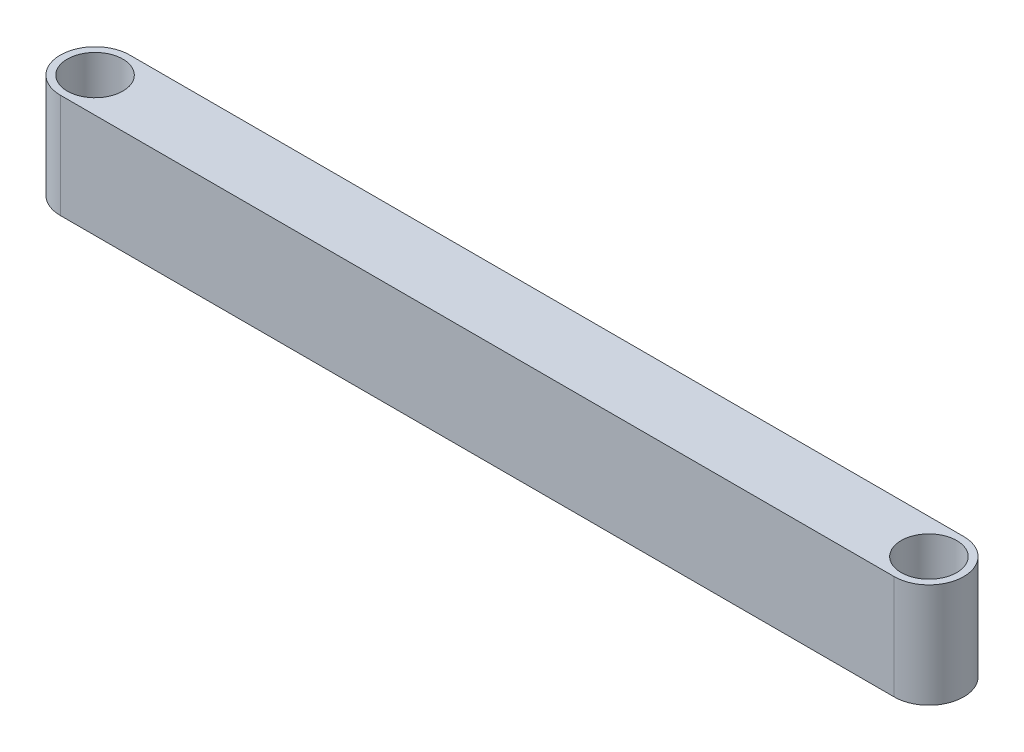
ISO-10303-21;
HEADER;
FILE_DESCRIPTION(('STEP AP214'),'2;1');
FILE_NAME('part.step','',(''),(''),'','','');
FILE_SCHEMA(('AUTOMOTIVE_DESIGN { 1 0 10303 214 1 1 1 1 }'));
ENDSEC;
DATA;
#1=APPLICATION_CONTEXT('core data for automotive mechanical design processes');
#2=APPLICATION_PROTOCOL_DEFINITION('international standard','automotive_design',2000,#1);
#3=PRODUCT_CONTEXT('',#1,'mechanical');
#4=PRODUCT('Part','Part','',(#3));
#5=PRODUCT_RELATED_PRODUCT_CATEGORY('part','',(#4));
#6=PRODUCT_DEFINITION_FORMATION('','',#4);
#7=PRODUCT_DEFINITION_CONTEXT('part definition',#1,'design');
#8=PRODUCT_DEFINITION('design','',#6,#7);
#9=PRODUCT_DEFINITION_SHAPE('','',#8);
#10=(LENGTH_UNIT() NAMED_UNIT(*) SI_UNIT(.MILLI.,.METRE.));
#11=(NAMED_UNIT(*) PLANE_ANGLE_UNIT() SI_UNIT($,.RADIAN.));
#12=(NAMED_UNIT(*) SI_UNIT($,.STERADIAN.) SOLID_ANGLE_UNIT());
#13=UNCERTAINTY_MEASURE_WITH_UNIT(LENGTH_MEASURE(1.E-05),#10,'distance_accuracy_value','');
#14=(GEOMETRIC_REPRESENTATION_CONTEXT(3) GLOBAL_UNCERTAINTY_ASSIGNED_CONTEXT((#13)) GLOBAL_UNIT_ASSIGNED_CONTEXT((#10,
#11,#12)) REPRESENTATION_CONTEXT('',''));
#15=CARTESIAN_POINT('',(0.,0.,0.));
#16=DIRECTION('',(0.,0.,1.));
#17=DIRECTION('',(1.,0.,0.));
#18=AXIS2_PLACEMENT_3D('',#15,#16,#17);
#19=CARTESIAN_POINT('',(-56.2743725544239,1.5,-11.7174624624736));
#20=DIRECTION('',(0.,1.,0.));
#21=DIRECTION('',(0.,0.,1.));
#22=AXIS2_PLACEMENT_3D('',#19,#20,#21);
#23=PLANE('',#22);
#24=CARTESIAN_POINT('',(-56.2743725544239,1.5,-11.7174624624736));
#25=DIRECTION('',(0.,1.,0.));
#26=DIRECTION('',(0.,0.,1.));
#27=AXIS2_PLACEMENT_3D('',#24,#25,#26);
#28=CIRCLE('',#27,0.399999999999998);
#29=CARTESIAN_POINT('',(-56.2743725544239,1.5,-11.3174624624736));
#30=VERTEX_POINT('',#29);
#31=EDGE_CURVE('E112',#30,#30,#28,.T.);
#32=ORIENTED_EDGE('',*,*,#31,.F.);
#33=EDGE_LOOP('',(#32));
#34=FACE_BOUND('',#33,.T.);
#35=CARTESIAN_POINT('',(-56.2743725544239,1.5,-11.7174624624736));
#36=DIRECTION('',(0.,1.,0.));
#37=DIRECTION('',(0.,0.,1.));
#38=AXIS2_PLACEMENT_3D('',#35,#36,#37);
#39=CIRCLE('',#38,0.5);
#40=CARTESIAN_POINT('',(-56.2743725544239,1.5,-12.2174624624736));
#41=VERTEX_POINT('',#40);
#42=CARTESIAN_POINT('',(-56.2743725544239,1.5,-11.2174624624736));
#43=VERTEX_POINT('',#42);
#44=EDGE_CURVE('E92',#41,#43,#39,.T.);
#45=ORIENTED_EDGE('',*,*,#44,.T.);
#46=DIRECTION('',(1.,0.,0.));
#47=VECTOR('',#46,1.);
#48=CARTESIAN_POINT('',(-56.2743725544239,1.5,-11.2174624624736));
#49=LINE('',#48,#47);
#50=CARTESIAN_POINT('',(-44.2743725544239,1.5,-11.2174624624736));
#51=VERTEX_POINT('',#50);
#52=EDGE_CURVE('E87',#43,#51,#49,.T.);
#53=ORIENTED_EDGE('',*,*,#52,.T.);
#54=CARTESIAN_POINT('',(-44.2743725544239,1.5,-11.7174624624736));
#55=DIRECTION('',(0.,1.,0.));
#56=DIRECTION('',(0.,0.,1.));
#57=AXIS2_PLACEMENT_3D('',#54,#55,#56);
#58=CIRCLE('',#57,0.5);
#59=CARTESIAN_POINT('',(-44.2743725544239,1.5,-12.2174624624736));
#60=VERTEX_POINT('',#59);
#61=EDGE_CURVE('E90',#51,#60,#58,.T.);
#62=ORIENTED_EDGE('',*,*,#61,.T.);
#63=DIRECTION('',(-1.,0.,0.));
#64=VECTOR('',#63,1.);
#65=CARTESIAN_POINT('',(-56.2743725544239,1.5,-12.2174624624736));
#66=LINE('',#65,#64);
#67=EDGE_CURVE('E57',#60,#41,#66,.T.);
#68=ORIENTED_EDGE('',*,*,#67,.T.);
#69=EDGE_LOOP('',(#45,#53,#62,#68));
#70=FACE_BOUND('',#69,.T.);
#71=CARTESIAN_POINT('',(-44.2743725544239,1.5,-11.7174624624736));
#72=DIRECTION('',(0.,1.,0.));
#73=DIRECTION('',(0.,0.,1.));
#74=AXIS2_PLACEMENT_3D('',#71,#72,#73);
#75=CIRCLE('',#74,0.399999999999998);
#76=CARTESIAN_POINT('',(-44.2743725544239,1.5,-11.3174624624736));
#77=VERTEX_POINT('',#76);
#78=EDGE_CURVE('E134',#77,#77,#75,.T.);
#79=ORIENTED_EDGE('',*,*,#78,.F.);
#80=EDGE_LOOP('',(#79));
#81=FACE_BOUND('',#80,.T.);
#82=ADVANCED_FACE('F39',(#34,#70,#81),#23,.T.);
#83=CARTESIAN_POINT('',(-56.2743725544239,0.,-11.7174624624736));
#84=DIRECTION('',(0.,1.,0.));
#85=DIRECTION('',(0.,0.,1.));
#86=AXIS2_PLACEMENT_3D('',#83,#84,#85);
#87=PLANE('',#86);
#88=CARTESIAN_POINT('',(-56.2743725544239,0.,-11.7174624624736));
#89=DIRECTION('',(0.,1.,0.));
#90=DIRECTION('',(0.,0.,1.));
#91=AXIS2_PLACEMENT_3D('',#88,#89,#90);
#92=CIRCLE('',#91,0.5);
#93=CARTESIAN_POINT('',(-56.2743725544239,0.,-12.2174624624736));
#94=VERTEX_POINT('',#93);
#95=CARTESIAN_POINT('',(-56.2743725544239,0.,-11.2174624624736));
#96=VERTEX_POINT('',#95);
#97=EDGE_CURVE('E108',#94,#96,#92,.T.);
#98=ORIENTED_EDGE('',*,*,#97,.F.);
#99=DIRECTION('',(-1.,0.,0.));
#100=VECTOR('',#99,1.);
#101=CARTESIAN_POINT('',(-56.2743725544239,0.,-12.2174624624736));
#102=LINE('',#101,#100);
#103=CARTESIAN_POINT('',(-44.2743725544239,0.,-12.2174624624736));
#104=VERTEX_POINT('',#103);
#105=EDGE_CURVE('E80',#104,#94,#102,.T.);
#106=ORIENTED_EDGE('',*,*,#105,.F.);
#107=CARTESIAN_POINT('',(-44.2743725544239,0.,-11.7174624624736));
#108=DIRECTION('',(0.,1.,0.));
#109=DIRECTION('',(0.,0.,1.));
#110=AXIS2_PLACEMENT_3D('',#107,#108,#109);
#111=CIRCLE('',#110,0.5);
#112=CARTESIAN_POINT('',(-44.2743725544239,0.,-11.2174624624736));
#113=VERTEX_POINT('',#112);
#114=EDGE_CURVE('E74',#113,#104,#111,.T.);
#115=ORIENTED_EDGE('',*,*,#114,.F.);
#116=DIRECTION('',(1.,0.,0.));
#117=VECTOR('',#116,1.);
#118=CARTESIAN_POINT('',(-56.2743725544239,0.,-11.2174624624736));
#119=LINE('',#118,#117);
#120=EDGE_CURVE('E97',#96,#113,#119,.T.);
#121=ORIENTED_EDGE('',*,*,#120,.F.);
#122=EDGE_LOOP('',(#98,#106,#115,#121));
#123=FACE_BOUND('',#122,.T.);
#124=CARTESIAN_POINT('',(-56.2743725544239,0.,-11.7174624624736));
#125=DIRECTION('',(0.,1.,0.));
#126=DIRECTION('',(0.,0.,1.));
#127=AXIS2_PLACEMENT_3D('',#124,#125,#126);
#128=CIRCLE('',#127,0.399999999999998);
#129=CARTESIAN_POINT('',(-56.2743725544239,0.,-11.3174624624736));
#130=VERTEX_POINT('',#129);
#131=EDGE_CURVE('E130',#130,#130,#128,.T.);
#132=ORIENTED_EDGE('',*,*,#131,.T.);
#133=EDGE_LOOP('',(#132));
#134=FACE_BOUND('',#133,.T.);
#135=CARTESIAN_POINT('',(-44.2743725544239,0.,-11.7174624624736));
#136=DIRECTION('',(0.,1.,0.));
#137=DIRECTION('',(0.,0.,1.));
#138=AXIS2_PLACEMENT_3D('',#135,#136,#137);
#139=CIRCLE('',#138,0.399999999999998);
#140=CARTESIAN_POINT('',(-44.2743725544239,0.,-11.3174624624736));
#141=VERTEX_POINT('',#140);
#142=EDGE_CURVE('E138',#141,#141,#139,.T.);
#143=ORIENTED_EDGE('',*,*,#142,.T.);
#144=EDGE_LOOP('',(#143));
#145=FACE_BOUND('',#144,.T.);
#146=ADVANCED_FACE('F125',(#123,#134,#145),#87,.F.);
#147=CARTESIAN_POINT('',(-56.2743725544239,1.5,-11.7174624624736));
#148=DIRECTION('',(0.,-1.,0.));
#149=DIRECTION('',(0.,0.,-1.));
#150=AXIS2_PLACEMENT_3D('',#147,#148,#149);
#151=CYLINDRICAL_SURFACE('',#150,0.5);
#152=ORIENTED_EDGE('',*,*,#97,.T.);
#153=DIRECTION('',(0.,-1.,0.));
#154=VECTOR('',#153,1.);
#155=CARTESIAN_POINT('',(-56.2743725544239,1.5,-11.2174624624736));
#156=LINE('',#155,#154);
#157=EDGE_CURVE('E11',#43,#96,#156,.T.);
#158=ORIENTED_EDGE('',*,*,#157,.F.);
#159=ORIENTED_EDGE('',*,*,#44,.F.);
#160=DIRECTION('',(0.,-1.,0.));
#161=VECTOR('',#160,1.);
#162=CARTESIAN_POINT('',(-56.2743725544239,1.5,-12.2174624624736));
#163=LINE('',#162,#161);
#164=EDGE_CURVE('E104',#41,#94,#163,.T.);
#165=ORIENTED_EDGE('',*,*,#164,.T.);
#166=EDGE_LOOP('',(#152,#158,#159,#165));
#167=FACE_BOUND('',#166,.T.);
#168=ADVANCED_FACE('F41',(#167),#151,.T.);
#169=CARTESIAN_POINT('',(-56.2743725544239,1.5,-11.2174624624736));
#170=DIRECTION('',(0.,0.,-1.));
#171=DIRECTION('',(-1.,0.,0.));
#172=AXIS2_PLACEMENT_3D('',#169,#170,#171);
#173=PLANE('',#172);
#174=ORIENTED_EDGE('',*,*,#120,.T.);
#175=DIRECTION('',(0.,-1.,0.));
#176=VECTOR('',#175,1.);
#177=CARTESIAN_POINT('',(-44.2743725544239,1.5,-11.2174624624736));
#178=LINE('',#177,#176);
#179=EDGE_CURVE('E49',#51,#113,#178,.T.);
#180=ORIENTED_EDGE('',*,*,#179,.F.);
#181=ORIENTED_EDGE('',*,*,#52,.F.);
#182=ORIENTED_EDGE('',*,*,#157,.T.);
#183=EDGE_LOOP('',(#174,#180,#181,#182));
#184=FACE_BOUND('',#183,.T.);
#185=ADVANCED_FACE('F96',(#184),#173,.F.);
#186=CARTESIAN_POINT('',(-44.2743725544239,1.5,-11.7174624624736));
#187=DIRECTION('',(0.,-1.,0.));
#188=DIRECTION('',(0.,0.,-1.));
#189=AXIS2_PLACEMENT_3D('',#186,#187,#188);
#190=CYLINDRICAL_SURFACE('',#189,0.5);
#191=ORIENTED_EDGE('',*,*,#114,.T.);
#192=DIRECTION('',(0.,-1.,0.));
#193=VECTOR('',#192,1.);
#194=CARTESIAN_POINT('',(-44.2743725544239,1.5,-12.2174624624736));
#195=LINE('',#194,#193);
#196=EDGE_CURVE('E99',#60,#104,#195,.T.);
#197=ORIENTED_EDGE('',*,*,#196,.F.);
#198=ORIENTED_EDGE('',*,*,#61,.F.);
#199=ORIENTED_EDGE('',*,*,#179,.T.);
#200=EDGE_LOOP('',(#191,#197,#198,#199));
#201=FACE_BOUND('',#200,.T.);
#202=ADVANCED_FACE('F100',(#201),#190,.T.);
#203=CARTESIAN_POINT('',(-56.2743725544239,1.5,-12.2174624624736));
#204=DIRECTION('',(0.,0.,1.));
#205=DIRECTION('',(1.,0.,0.));
#206=AXIS2_PLACEMENT_3D('',#203,#204,#205);
#207=PLANE('',#206);
#208=ORIENTED_EDGE('',*,*,#105,.T.);
#209=ORIENTED_EDGE('',*,*,#164,.F.);
#210=ORIENTED_EDGE('',*,*,#67,.F.);
#211=ORIENTED_EDGE('',*,*,#196,.T.);
#212=EDGE_LOOP('',(#208,#209,#210,#211));
#213=FACE_BOUND('',#212,.T.);
#214=ADVANCED_FACE('F122',(#213),#207,.F.);
#215=CARTESIAN_POINT('',(-56.2743725544239,1.5,-11.7174624624736));
#216=DIRECTION('',(0.,-1.,0.));
#217=DIRECTION('',(0.,0.,-1.));
#218=AXIS2_PLACEMENT_3D('',#215,#216,#217);
#219=CYLINDRICAL_SURFACE('',#218,0.399999999999998);
#220=ORIENTED_EDGE('',*,*,#31,.T.);
#221=EDGE_LOOP('',(#220));
#222=FACE_BOUND('',#221,.T.);
#223=ORIENTED_EDGE('',*,*,#131,.F.);
#224=EDGE_LOOP('',(#223));
#225=FACE_BOUND('',#224,.T.);
#226=ADVANCED_FACE('F157',(#222,#225),#219,.F.);
#227=CARTESIAN_POINT('',(-44.2743725544239,1.5,-11.7174624624736));
#228=DIRECTION('',(0.,-1.,0.));
#229=DIRECTION('',(0.,0.,-1.));
#230=AXIS2_PLACEMENT_3D('',#227,#228,#229);
#231=CYLINDRICAL_SURFACE('',#230,0.399999999999998);
#232=ORIENTED_EDGE('',*,*,#78,.T.);
#233=EDGE_LOOP('',(#232));
#234=FACE_BOUND('',#233,.T.);
#235=ORIENTED_EDGE('',*,*,#142,.F.);
#236=EDGE_LOOP('',(#235));
#237=FACE_BOUND('',#236,.T.);
#238=ADVANCED_FACE('F146',(#234,#237),#231,.F.);
#239=CLOSED_SHELL('',(#82,#146,#168,#185,#202,#214,#226,#238));
#240=MANIFOLD_SOLID_BREP('B2',#239);
#241=ADVANCED_BREP_SHAPE_REPRESENTATION('',(#18,#240),#14);
#242=SHAPE_DEFINITION_REPRESENTATION(#9,#241);
ENDSEC;
END-ISO-10303-21;
